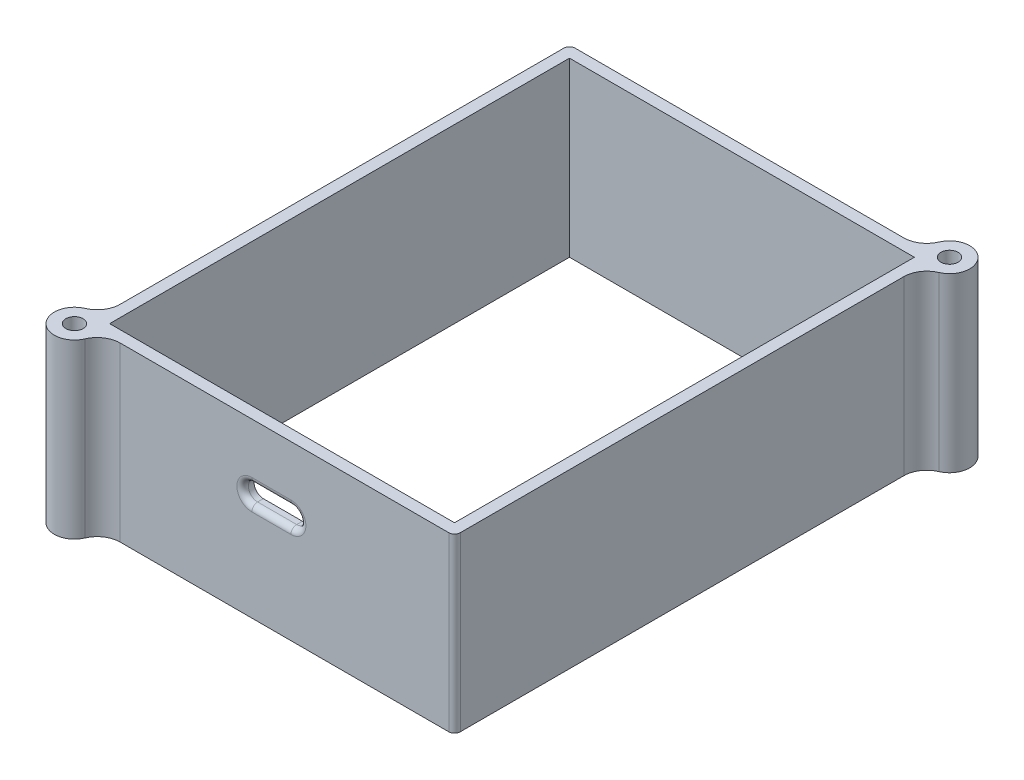
ISO-10303-21;
HEADER;
FILE_DESCRIPTION(('STEP AP214'),'2;1');
FILE_NAME('part.step','',(''),(''),'','','');
FILE_SCHEMA(('AUTOMOTIVE_DESIGN { 1 0 10303 214 1 1 1 1 }'));
ENDSEC;
DATA;
#1=APPLICATION_CONTEXT('core data for automotive mechanical design processes');
#2=APPLICATION_PROTOCOL_DEFINITION('international standard','automotive_design',2000,#1);
#3=PRODUCT_CONTEXT('',#1,'mechanical');
#4=PRODUCT('Part','Part','',(#3));
#5=PRODUCT_RELATED_PRODUCT_CATEGORY('part','',(#4));
#6=PRODUCT_DEFINITION_FORMATION('','',#4);
#7=PRODUCT_DEFINITION_CONTEXT('part definition',#1,'design');
#8=PRODUCT_DEFINITION('design','',#6,#7);
#9=PRODUCT_DEFINITION_SHAPE('','',#8);
#10=(LENGTH_UNIT() NAMED_UNIT(*) SI_UNIT(.MILLI.,.METRE.));
#11=(NAMED_UNIT(*) PLANE_ANGLE_UNIT() SI_UNIT($,.RADIAN.));
#12=(NAMED_UNIT(*) SI_UNIT($,.STERADIAN.) SOLID_ANGLE_UNIT());
#13=UNCERTAINTY_MEASURE_WITH_UNIT(LENGTH_MEASURE(1.E-05),#10,'distance_accuracy_value','');
#14=(GEOMETRIC_REPRESENTATION_CONTEXT(3) GLOBAL_UNCERTAINTY_ASSIGNED_CONTEXT((#13)) GLOBAL_UNIT_ASSIGNED_CONTEXT((#10,
#11,#12)) REPRESENTATION_CONTEXT('',''));
#15=CARTESIAN_POINT('',(0.,0.,0.));
#16=DIRECTION('',(0.,0.,1.));
#17=DIRECTION('',(1.,0.,0.));
#18=AXIS2_PLACEMENT_3D('',#15,#16,#17);
#19=CARTESIAN_POINT('',(62.,30.,82.));
#20=DIRECTION('',(0.,0.,-1.));
#21=DIRECTION('',(-1.,0.,0.));
#22=AXIS2_PLACEMENT_3D('',#19,#20,#21);
#23=PLANE('',#22);
#24=DIRECTION('',(1.,0.,0.));
#25=VECTOR('',#24,1.);
#26=CARTESIAN_POINT('',(62.,16.,82.));
#27=LINE('',#26,#25);
#28=CARTESIAN_POINT('',(33.5413148667545,16.,82.));
#29=VERTEX_POINT('',#28);
#30=CARTESIAN_POINT('',(26.7413148667545,16.,82.));
#31=VERTEX_POINT('',#30);
#32=EDGE_CURVE('E229',#29,#31,#27,.F.);
#33=ORIENTED_EDGE('',*,*,#32,.T.);
#34=CARTESIAN_POINT('',(26.7413148667545,18.6,82.));
#35=DIRECTION('',(0.,0.,-1.));
#36=DIRECTION('',(-1.,0.,0.));
#37=AXIS2_PLACEMENT_3D('',#34,#35,#36);
#38=CIRCLE('',#37,2.6);
#39=CARTESIAN_POINT('',(26.7413148667545,21.2,82.));
#40=VERTEX_POINT('',#39);
#41=EDGE_CURVE('E242',#31,#40,#38,.T.);
#42=ORIENTED_EDGE('',*,*,#41,.T.);
#43=DIRECTION('',(-1.,0.,0.));
#44=VECTOR('',#43,1.);
#45=CARTESIAN_POINT('',(62.,21.2,82.));
#46=LINE('',#45,#44);
#47=CARTESIAN_POINT('',(33.5413148667545,21.2,82.));
#48=VERTEX_POINT('',#47);
#49=EDGE_CURVE('E239',#40,#48,#46,.F.);
#50=ORIENTED_EDGE('',*,*,#49,.T.);
#51=CARTESIAN_POINT('',(33.5413148667545,18.6,82.));
#52=DIRECTION('',(0.,0.,-1.));
#53=DIRECTION('',(-1.,0.,0.));
#54=AXIS2_PLACEMENT_3D('',#51,#52,#53);
#55=CIRCLE('',#54,2.6);
#56=EDGE_CURVE('E236',#48,#29,#55,.T.);
#57=ORIENTED_EDGE('',*,*,#56,.T.);
#58=EDGE_LOOP('',(#33,#42,#50,#57));
#59=FACE_BOUND('',#58,.T.);
#60=DIRECTION('',(1.,0.,0.));
#61=VECTOR('',#60,1.);
#62=CARTESIAN_POINT('',(62.,0.,82.));
#63=LINE('',#62,#61);
#64=CARTESIAN_POINT('',(3.83936021762763,0.,82.));
#65=VERTEX_POINT('',#64);
#66=CARTESIAN_POINT('',(61.,0.,82.));
#67=VERTEX_POINT('',#66);
#68=EDGE_CURVE('E358',#65,#67,#63,.T.);
#69=ORIENTED_EDGE('',*,*,#68,.T.);
#70=DIRECTION('',(0.,-1.,0.));
#71=VECTOR('',#70,1.);
#72=CARTESIAN_POINT('',(61.,30.,82.));
#73=LINE('',#72,#71);
#74=CARTESIAN_POINT('',(61.,30.,82.));
#75=VERTEX_POINT('',#74);
#76=EDGE_CURVE('E11',#67,#75,#73,.F.);
#77=ORIENTED_EDGE('',*,*,#76,.T.);
#78=DIRECTION('',(1.,0.,0.));
#79=VECTOR('',#78,1.);
#80=CARTESIAN_POINT('',(62.,30.,82.));
#81=LINE('',#80,#79);
#82=CARTESIAN_POINT('',(3.83936021762763,30.,82.));
#83=VERTEX_POINT('',#82);
#84=EDGE_CURVE('E370',#83,#75,#81,.T.);
#85=ORIENTED_EDGE('',*,*,#84,.F.);
#86=DIRECTION('',(0.,1.,0.));
#87=VECTOR('',#86,1.);
#88=CARTESIAN_POINT('',(3.83936021762763,0.,82.));
#89=LINE('',#88,#87);
#90=EDGE_CURVE('E294',#83,#65,#89,.F.);
#91=ORIENTED_EDGE('',*,*,#90,.T.);
#92=EDGE_LOOP('',(#69,#77,#85,#91));
#93=FACE_BOUND('',#92,.T.);
#94=ADVANCED_FACE('F44',(#59,#93),#23,.F.);
#95=CARTESIAN_POINT('',(62.,30.,-2.));
#96=DIRECTION('',(-1.,0.,0.));
#97=DIRECTION('',(0.,0.,1.));
#98=AXIS2_PLACEMENT_3D('',#95,#96,#97);
#99=PLANE('',#98);
#100=DIRECTION('',(0.,0.,-1.));
#101=VECTOR('',#100,1.);
#102=CARTESIAN_POINT('',(62.,30.,-2.));
#103=LINE('',#102,#101);
#104=CARTESIAN_POINT('',(62.,30.,81.));
#105=VERTEX_POINT('',#104);
#106=CARTESIAN_POINT('',(62.,30.,3.83936021762763));
#107=VERTEX_POINT('',#106);
#108=EDGE_CURVE('E347',#105,#107,#103,.T.);
#109=ORIENTED_EDGE('',*,*,#108,.F.);
#110=DIRECTION('',(0.,-1.,0.));
#111=VECTOR('',#110,1.);
#112=CARTESIAN_POINT('',(62.,30.,81.));
#113=LINE('',#112,#111);
#114=CARTESIAN_POINT('',(62.,0.,81.));
#115=VERTEX_POINT('',#114);
#116=EDGE_CURVE('E53',#105,#115,#113,.T.);
#117=ORIENTED_EDGE('',*,*,#116,.T.);
#118=DIRECTION('',(0.,0.,-1.));
#119=VECTOR('',#118,1.);
#120=CARTESIAN_POINT('',(62.,0.,-2.));
#121=LINE('',#120,#119);
#122=CARTESIAN_POINT('',(62.,0.,3.83936021762763));
#123=VERTEX_POINT('',#122);
#124=EDGE_CURVE('E346',#115,#123,#121,.T.);
#125=ORIENTED_EDGE('',*,*,#124,.T.);
#126=DIRECTION('',(0.,1.,0.));
#127=VECTOR('',#126,1.);
#128=CARTESIAN_POINT('',(62.,30.,3.83936021762763));
#129=LINE('',#128,#127);
#130=EDGE_CURVE('E275',#123,#107,#129,.T.);
#131=ORIENTED_EDGE('',*,*,#130,.T.);
#132=EDGE_LOOP('',(#109,#117,#125,#131));
#133=FACE_BOUND('',#132,.T.);
#134=ADVANCED_FACE('F345',(#133),#99,.F.);
#135=CARTESIAN_POINT('',(-2.,30.,-2.));
#136=DIRECTION('',(0.,0.,1.));
#137=DIRECTION('',(1.,0.,0.));
#138=AXIS2_PLACEMENT_3D('',#135,#136,#137);
#139=PLANE('',#138);
#140=DIRECTION('',(-1.,0.,0.));
#141=VECTOR('',#140,1.);
#142=CARTESIAN_POINT('',(-2.,0.,-2.));
#143=LINE('',#142,#141);
#144=CARTESIAN_POINT('',(56.1606397823724,0.,-2.));
#145=VERTEX_POINT('',#144);
#146=CARTESIAN_POINT('',(-1.,0.,-2.));
#147=VERTEX_POINT('',#146);
#148=EDGE_CURVE('E357',#145,#147,#143,.T.);
#149=ORIENTED_EDGE('',*,*,#148,.T.);
#150=DIRECTION('',(0.,-1.,0.));
#151=VECTOR('',#150,1.);
#152=CARTESIAN_POINT('',(-1.,30.,-2.));
#153=LINE('',#152,#151);
#154=CARTESIAN_POINT('',(-1.,30.,-2.));
#155=VERTEX_POINT('',#154);
#156=EDGE_CURVE('E333',#147,#155,#153,.F.);
#157=ORIENTED_EDGE('',*,*,#156,.T.);
#158=DIRECTION('',(-1.,0.,0.));
#159=VECTOR('',#158,1.);
#160=CARTESIAN_POINT('',(-2.,30.,-2.));
#161=LINE('',#160,#159);
#162=CARTESIAN_POINT('',(56.1606397823724,30.,-2.));
#163=VERTEX_POINT('',#162);
#164=EDGE_CURVE('E467',#163,#155,#161,.T.);
#165=ORIENTED_EDGE('',*,*,#164,.F.);
#166=DIRECTION('',(0.,1.,0.));
#167=VECTOR('',#166,1.);
#168=CARTESIAN_POINT('',(56.1606397823724,0.,-2.));
#169=LINE('',#168,#167);
#170=EDGE_CURVE('E279',#163,#145,#169,.F.);
#171=ORIENTED_EDGE('',*,*,#170,.T.);
#172=EDGE_LOOP('',(#149,#157,#165,#171));
#173=FACE_BOUND('',#172,.T.);
#174=ADVANCED_FACE('F505',(#173),#139,.F.);
#175=CARTESIAN_POINT('',(-2.,30.,82.));
#176=DIRECTION('',(1.,0.,0.));
#177=DIRECTION('',(0.,0.,-1.));
#178=AXIS2_PLACEMENT_3D('',#175,#176,#177);
#179=PLANE('',#178);
#180=DIRECTION('',(0.,0.,1.));
#181=VECTOR('',#180,1.);
#182=CARTESIAN_POINT('',(-2.,30.,82.));
#183=LINE('',#182,#181);
#184=CARTESIAN_POINT('',(-2.,30.,-0.999999999999973));
#185=VERTEX_POINT('',#184);
#186=CARTESIAN_POINT('',(-2.,30.,76.1606397823724));
#187=VERTEX_POINT('',#186);
#188=EDGE_CURVE('E207',#185,#187,#183,.T.);
#189=ORIENTED_EDGE('',*,*,#188,.F.);
#190=DIRECTION('',(0.,-1.,0.));
#191=VECTOR('',#190,1.);
#192=CARTESIAN_POINT('',(-2.,30.,-1.));
#193=LINE('',#192,#191);
#194=CARTESIAN_POINT('',(-2.,0.,-0.999999999999973));
#195=VERTEX_POINT('',#194);
#196=EDGE_CURVE('E323',#185,#195,#193,.T.);
#197=ORIENTED_EDGE('',*,*,#196,.T.);
#198=DIRECTION('',(0.,0.,1.));
#199=VECTOR('',#198,1.);
#200=CARTESIAN_POINT('',(-2.,0.,82.));
#201=LINE('',#200,#199);
#202=CARTESIAN_POINT('',(-2.,0.,76.1606397823724));
#203=VERTEX_POINT('',#202);
#204=EDGE_CURVE('E363',#195,#203,#201,.T.);
#205=ORIENTED_EDGE('',*,*,#204,.T.);
#206=DIRECTION('',(0.,1.,0.));
#207=VECTOR('',#206,1.);
#208=CARTESIAN_POINT('',(-2.,30.,76.1606397823724));
#209=LINE('',#208,#207);
#210=EDGE_CURVE('E290',#203,#187,#209,.T.);
#211=ORIENTED_EDGE('',*,*,#210,.T.);
#212=EDGE_LOOP('',(#189,#197,#205,#211));
#213=FACE_BOUND('',#212,.T.);
#214=ADVANCED_FACE('F480',(#213),#179,.F.);
#215=CARTESIAN_POINT('',(0.,30.,0.));
#216=DIRECTION('',(0.,-1.,0.));
#217=DIRECTION('',(0.,0.,-1.));
#218=AXIS2_PLACEMENT_3D('',#215,#216,#217);
#219=PLANE('',#218);
#220=ORIENTED_EDGE('',*,*,#164,.T.);
#221=CARTESIAN_POINT('',(-1.,30.,-1.));
#222=DIRECTION('',(0.,-1.,0.));
#223=DIRECTION('',(0.,0.,-1.));
#224=AXIS2_PLACEMENT_3D('',#221,#222,#223);
#225=CIRCLE('',#224,1.);
#226=EDGE_CURVE('E338',#155,#185,#225,.F.);
#227=ORIENTED_EDGE('',*,*,#226,.T.);
#228=ORIENTED_EDGE('',*,*,#188,.T.);
#229=CARTESIAN_POINT('',(-6.,30.,76.1606397823724));
#230=DIRECTION('',(0.,-1.,0.));
#231=DIRECTION('',(0.,0.,-1.));
#232=AXIS2_PLACEMENT_3D('',#229,#230,#231);
#233=CIRCLE('',#232,4.);
#234=CARTESIAN_POINT('',(-4.4323520916159,30.,79.840650656723));
#235=VERTEX_POINT('',#234);
#236=EDGE_CURVE('E314',#187,#235,#233,.T.);
#237=ORIENTED_EDGE('',*,*,#236,.T.);
#238=CARTESIAN_POINT('',(-3.06066017177982,30.,83.0606601717798));
#239=DIRECTION('',(0.,1.,0.));
#240=DIRECTION('',(0.,0.,1.));
#241=AXIS2_PLACEMENT_3D('',#238,#239,#240);
#242=CIRCLE('',#241,3.5);
#243=CARTESIAN_POINT('',(0.159349343276988,30.,84.4323520916159));
#244=VERTEX_POINT('',#243);
#245=EDGE_CURVE('E400',#235,#244,#242,.T.);
#246=ORIENTED_EDGE('',*,*,#245,.T.);
#247=CARTESIAN_POINT('',(3.83936021762763,30.,86.));
#248=DIRECTION('',(0.,-1.,0.));
#249=DIRECTION('',(0.,0.,-1.));
#250=AXIS2_PLACEMENT_3D('',#247,#248,#249);
#251=CIRCLE('',#250,4.);
#252=EDGE_CURVE('E317',#244,#83,#251,.T.);
#253=ORIENTED_EDGE('',*,*,#252,.T.);
#254=ORIENTED_EDGE('',*,*,#84,.T.);
#255=CARTESIAN_POINT('',(61.,30.,81.));
#256=DIRECTION('',(0.,-1.,0.));
#257=DIRECTION('',(0.,0.,-1.));
#258=AXIS2_PLACEMENT_3D('',#255,#256,#257);
#259=CIRCLE('',#258,1.);
#260=EDGE_CURVE('E60',#75,#105,#259,.F.);
#261=ORIENTED_EDGE('',*,*,#260,.T.);
#262=ORIENTED_EDGE('',*,*,#108,.T.);
#263=CARTESIAN_POINT('',(66.,30.,3.83936021762763));
#264=DIRECTION('',(0.,-1.,0.));
#265=DIRECTION('',(0.,0.,-1.));
#266=AXIS2_PLACEMENT_3D('',#263,#264,#265);
#267=CIRCLE('',#266,4.);
#268=CARTESIAN_POINT('',(64.4323520916159,30.,0.159349343276991));
#269=VERTEX_POINT('',#268);
#270=EDGE_CURVE('E301',#107,#269,#267,.T.);
#271=ORIENTED_EDGE('',*,*,#270,.T.);
#272=CARTESIAN_POINT('',(63.0606601717798,30.,-3.06066017177982));
#273=DIRECTION('',(0.,1.,0.));
#274=DIRECTION('',(0.,0.,1.));
#275=AXIS2_PLACEMENT_3D('',#272,#273,#274);
#276=CIRCLE('',#275,3.50000000000001);
#277=CARTESIAN_POINT('',(59.840650656723,30.,-4.43235209161591));
#278=VERTEX_POINT('',#277);
#279=EDGE_CURVE('E386',#269,#278,#276,.T.);
#280=ORIENTED_EDGE('',*,*,#279,.T.);
#281=CARTESIAN_POINT('',(56.1606397823724,30.,-6.));
#282=DIRECTION('',(0.,-1.,0.));
#283=DIRECTION('',(0.,0.,-1.));
#284=AXIS2_PLACEMENT_3D('',#281,#282,#283);
#285=CIRCLE('',#284,4.);
#286=EDGE_CURVE('E304',#278,#163,#285,.T.);
#287=ORIENTED_EDGE('',*,*,#286,.T.);
#288=EDGE_LOOP('',(#220,#227,#228,#237,#246,#253,#254,#261,#262,#271,#280,#287));
#289=FACE_BOUND('',#288,.T.);
#290=DIRECTION('',(0.,0.,1.));
#291=VECTOR('',#290,1.);
#292=CARTESIAN_POINT('',(0.,30.,80.));
#293=LINE('',#292,#291);
#294=CARTESIAN_POINT('',(0.,30.,0.));
#295=VERTEX_POINT('',#294);
#296=CARTESIAN_POINT('',(0.,30.,80.));
#297=VERTEX_POINT('',#296);
#298=EDGE_CURVE('E422',#295,#297,#293,.T.);
#299=ORIENTED_EDGE('',*,*,#298,.F.);
#300=DIRECTION('',(-1.,0.,0.));
#301=VECTOR('',#300,1.);
#302=CARTESIAN_POINT('',(0.,30.,0.));
#303=LINE('',#302,#301);
#304=CARTESIAN_POINT('',(60.,30.,0.));
#305=VERTEX_POINT('',#304);
#306=EDGE_CURVE('E433',#305,#295,#303,.T.);
#307=ORIENTED_EDGE('',*,*,#306,.F.);
#308=DIRECTION('',(0.,0.,-1.));
#309=VECTOR('',#308,1.);
#310=CARTESIAN_POINT('',(60.,30.,0.));
#311=LINE('',#310,#309);
#312=CARTESIAN_POINT('',(60.,30.,80.));
#313=VERTEX_POINT('',#312);
#314=EDGE_CURVE('E429',#313,#305,#311,.T.);
#315=ORIENTED_EDGE('',*,*,#314,.F.);
#316=DIRECTION('',(1.,0.,0.));
#317=VECTOR('',#316,1.);
#318=CARTESIAN_POINT('',(60.,30.,80.));
#319=LINE('',#318,#317);
#320=EDGE_CURVE('E425',#297,#313,#319,.T.);
#321=ORIENTED_EDGE('',*,*,#320,.F.);
#322=EDGE_LOOP('',(#299,#307,#315,#321));
#323=FACE_BOUND('',#322,.T.);
#324=CARTESIAN_POINT('',(63.0606601717798,30.,-3.06066017177982));
#325=DIRECTION('',(0.,1.,0.));
#326=DIRECTION('',(0.,0.,1.));
#327=AXIS2_PLACEMENT_3D('',#324,#325,#326);
#328=CIRCLE('',#327,1.5);
#329=CARTESIAN_POINT('',(63.0606601717798,30.,-1.56066017177983));
#330=VERTEX_POINT('',#329);
#331=EDGE_CURVE('E412',#330,#330,#328,.T.);
#332=ORIENTED_EDGE('',*,*,#331,.F.);
#333=EDGE_LOOP('',(#332));
#334=FACE_BOUND('',#333,.T.);
#335=CARTESIAN_POINT('',(-3.06066017177982,30.,83.0606601717798));
#336=DIRECTION('',(0.,1.,0.));
#337=DIRECTION('',(0.,0.,1.));
#338=AXIS2_PLACEMENT_3D('',#335,#336,#337);
#339=CIRCLE('',#338,1.5);
#340=CARTESIAN_POINT('',(-3.06066017177982,30.,84.5606601717798));
#341=VERTEX_POINT('',#340);
#342=EDGE_CURVE('E390',#341,#341,#339,.T.);
#343=ORIENTED_EDGE('',*,*,#342,.F.);
#344=EDGE_LOOP('',(#343));
#345=FACE_BOUND('',#344,.T.);
#346=ADVANCED_FACE('F472',(#289,#323,#334,#345),#219,.F.);
#347=CARTESIAN_POINT('',(0.,0.,0.));
#348=DIRECTION('',(0.,-1.,0.));
#349=DIRECTION('',(0.,0.,-1.));
#350=AXIS2_PLACEMENT_3D('',#347,#348,#349);
#351=PLANE('',#350);
#352=ORIENTED_EDGE('',*,*,#204,.F.);
#353=CARTESIAN_POINT('',(-1.,0.,-1.));
#354=DIRECTION('',(0.,-1.,0.));
#355=DIRECTION('',(0.,0.,-1.));
#356=AXIS2_PLACEMENT_3D('',#353,#354,#355);
#357=CIRCLE('',#356,1.);
#358=EDGE_CURVE('E330',#195,#147,#357,.T.);
#359=ORIENTED_EDGE('',*,*,#358,.T.);
#360=ORIENTED_EDGE('',*,*,#148,.F.);
#361=CARTESIAN_POINT('',(56.1606397823724,0.,-6.));
#362=DIRECTION('',(0.,-1.,0.));
#363=DIRECTION('',(0.,0.,-1.));
#364=AXIS2_PLACEMENT_3D('',#361,#362,#363);
#365=CIRCLE('',#364,4.);
#366=CARTESIAN_POINT('',(59.840650656723,0.,-4.43235209161591));
#367=VERTEX_POINT('',#366);
#368=EDGE_CURVE('E307',#145,#367,#365,.F.);
#369=ORIENTED_EDGE('',*,*,#368,.T.);
#370=CARTESIAN_POINT('',(63.0606601717798,0.,-3.06066017177982));
#371=DIRECTION('',(0.,1.,0.));
#372=DIRECTION('',(0.,0.,1.));
#373=AXIS2_PLACEMENT_3D('',#370,#371,#372);
#374=CIRCLE('',#373,3.50000000000001);
#375=CARTESIAN_POINT('',(64.4323520916159,0.,0.159349343276991));
#376=VERTEX_POINT('',#375);
#377=EDGE_CURVE('E408',#376,#367,#374,.T.);
#378=ORIENTED_EDGE('',*,*,#377,.F.);
#379=CARTESIAN_POINT('',(66.,0.,3.83936021762763));
#380=DIRECTION('',(0.,-1.,0.));
#381=DIRECTION('',(0.,0.,-1.));
#382=AXIS2_PLACEMENT_3D('',#379,#380,#381);
#383=CIRCLE('',#382,4.);
#384=EDGE_CURVE('E297',#376,#123,#383,.F.);
#385=ORIENTED_EDGE('',*,*,#384,.T.);
#386=ORIENTED_EDGE('',*,*,#124,.F.);
#387=CARTESIAN_POINT('',(61.,0.,81.));
#388=DIRECTION('',(0.,-1.,0.));
#389=DIRECTION('',(0.,0.,-1.));
#390=AXIS2_PLACEMENT_3D('',#387,#388,#389);
#391=CIRCLE('',#390,1.);
#392=EDGE_CURVE('E327',#115,#67,#391,.T.);
#393=ORIENTED_EDGE('',*,*,#392,.T.);
#394=ORIENTED_EDGE('',*,*,#68,.F.);
#395=CARTESIAN_POINT('',(3.83936021762763,0.,86.));
#396=DIRECTION('',(0.,-1.,0.));
#397=DIRECTION('',(0.,0.,-1.));
#398=AXIS2_PLACEMENT_3D('',#395,#396,#397);
#399=CIRCLE('',#398,4.);
#400=CARTESIAN_POINT('',(0.159349343276988,0.,84.4323520916159));
#401=VERTEX_POINT('',#400);
#402=EDGE_CURVE('E320',#65,#401,#399,.F.);
#403=ORIENTED_EDGE('',*,*,#402,.T.);
#404=CARTESIAN_POINT('',(-3.06066017177982,0.,83.0606601717798));
#405=DIRECTION('',(0.,1.,0.));
#406=DIRECTION('',(0.,0.,1.));
#407=AXIS2_PLACEMENT_3D('',#404,#405,#406);
#408=CIRCLE('',#407,3.5);
#409=CARTESIAN_POINT('',(-4.4323520916159,0.,79.840650656723));
#410=VERTEX_POINT('',#409);
#411=EDGE_CURVE('E394',#410,#401,#408,.T.);
#412=ORIENTED_EDGE('',*,*,#411,.F.);
#413=CARTESIAN_POINT('',(-6.,0.,76.1606397823724));
#414=DIRECTION('',(0.,-1.,0.));
#415=DIRECTION('',(0.,0.,-1.));
#416=AXIS2_PLACEMENT_3D('',#413,#414,#415);
#417=CIRCLE('',#416,4.);
#418=EDGE_CURVE('E310',#410,#203,#417,.F.);
#419=ORIENTED_EDGE('',*,*,#418,.T.);
#420=EDGE_LOOP('',(#352,#359,#360,#369,#378,#385,#386,#393,#394,#403,#412,#419));
#421=FACE_BOUND('',#420,.T.);
#422=DIRECTION('',(-1.,0.,0.));
#423=VECTOR('',#422,1.);
#424=CARTESIAN_POINT('',(0.,0.,0.));
#425=LINE('',#424,#423);
#426=CARTESIAN_POINT('',(60.,0.,0.));
#427=VERTEX_POINT('',#426);
#428=CARTESIAN_POINT('',(0.,0.,0.));
#429=VERTEX_POINT('',#428);
#430=EDGE_CURVE('E426',#427,#429,#425,.T.);
#431=ORIENTED_EDGE('',*,*,#430,.T.);
#432=DIRECTION('',(0.,0.,1.));
#433=VECTOR('',#432,1.);
#434=CARTESIAN_POINT('',(0.,0.,80.));
#435=LINE('',#434,#433);
#436=CARTESIAN_POINT('',(0.,0.,80.));
#437=VERTEX_POINT('',#436);
#438=EDGE_CURVE('E404',#429,#437,#435,.T.);
#439=ORIENTED_EDGE('',*,*,#438,.T.);
#440=DIRECTION('',(1.,0.,0.));
#441=VECTOR('',#440,1.);
#442=CARTESIAN_POINT('',(60.,0.,80.));
#443=LINE('',#442,#441);
#444=CARTESIAN_POINT('',(60.,0.,80.));
#445=VERTEX_POINT('',#444);
#446=EDGE_CURVE('E440',#437,#445,#443,.T.);
#447=ORIENTED_EDGE('',*,*,#446,.T.);
#448=DIRECTION('',(0.,0.,-1.));
#449=VECTOR('',#448,1.);
#450=CARTESIAN_POINT('',(60.,0.,0.));
#451=LINE('',#450,#449);
#452=EDGE_CURVE('E444',#445,#427,#451,.T.);
#453=ORIENTED_EDGE('',*,*,#452,.T.);
#454=EDGE_LOOP('',(#431,#439,#447,#453));
#455=FACE_BOUND('',#454,.T.);
#456=CARTESIAN_POINT('',(63.0606601717798,0.,-3.06066017177982));
#457=DIRECTION('',(0.,1.,0.));
#458=DIRECTION('',(0.,0.,1.));
#459=AXIS2_PLACEMENT_3D('',#456,#457,#458);
#460=CIRCLE('',#459,1.5);
#461=CARTESIAN_POINT('',(63.0606601717798,0.,-1.56066017177983));
#462=VERTEX_POINT('',#461);
#463=EDGE_CURVE('E399',#462,#462,#460,.T.);
#464=ORIENTED_EDGE('',*,*,#463,.T.);
#465=EDGE_LOOP('',(#464));
#466=FACE_BOUND('',#465,.T.);
#467=CARTESIAN_POINT('',(-3.06066017177982,0.,83.0606601717798));
#468=DIRECTION('',(0.,1.,0.));
#469=DIRECTION('',(0.,0.,1.));
#470=AXIS2_PLACEMENT_3D('',#467,#468,#469);
#471=CIRCLE('',#470,1.5);
#472=CARTESIAN_POINT('',(-3.06066017177982,0.,84.5606601717798));
#473=VERTEX_POINT('',#472);
#474=EDGE_CURVE('E395',#473,#473,#471,.T.);
#475=ORIENTED_EDGE('',*,*,#474,.T.);
#476=EDGE_LOOP('',(#475));
#477=FACE_BOUND('',#476,.T.);
#478=ADVANCED_FACE('F351',(#421,#455,#466,#477),#351,.T.);
#479=CARTESIAN_POINT('',(0.,30.,80.));
#480=DIRECTION('',(1.,0.,0.));
#481=DIRECTION('',(0.,0.,-1.));
#482=AXIS2_PLACEMENT_3D('',#479,#480,#481);
#483=PLANE('',#482);
#484=ORIENTED_EDGE('',*,*,#438,.F.);
#485=DIRECTION('',(0.,-1.,0.));
#486=VECTOR('',#485,1.);
#487=CARTESIAN_POINT('',(0.,30.,0.));
#488=LINE('',#487,#486);
#489=EDGE_CURVE('E436',#295,#429,#488,.T.);
#490=ORIENTED_EDGE('',*,*,#489,.F.);
#491=ORIENTED_EDGE('',*,*,#298,.T.);
#492=DIRECTION('',(0.,-1.,0.));
#493=VECTOR('',#492,1.);
#494=CARTESIAN_POINT('',(0.,30.,80.));
#495=LINE('',#494,#493);
#496=EDGE_CURVE('E365',#297,#437,#495,.T.);
#497=ORIENTED_EDGE('',*,*,#496,.T.);
#498=EDGE_LOOP('',(#484,#490,#491,#497));
#499=FACE_BOUND('',#498,.T.);
#500=ADVANCED_FACE('F632',(#499),#483,.T.);
#501=CARTESIAN_POINT('',(60.,30.,80.));
#502=DIRECTION('',(0.,0.,-1.));
#503=DIRECTION('',(-1.,0.,0.));
#504=AXIS2_PLACEMENT_3D('',#501,#502,#503);
#505=PLANE('',#504);
#506=DIRECTION('',(-1.,0.,0.));
#507=VECTOR('',#506,1.);
#508=CARTESIAN_POINT('',(60.,17.,80.));
#509=LINE('',#508,#507);
#510=CARTESIAN_POINT('',(33.5413148667545,17.,80.));
#511=VERTEX_POINT('',#510);
#512=CARTESIAN_POINT('',(26.7413148667545,17.,80.));
#513=VERTEX_POINT('',#512);
#514=EDGE_CURVE('E212',#511,#513,#509,.T.);
#515=ORIENTED_EDGE('',*,*,#514,.F.);
#516=CARTESIAN_POINT('',(33.5413148667545,18.6,80.));
#517=DIRECTION('',(0.,0.,-1.));
#518=DIRECTION('',(-1.,0.,0.));
#519=AXIS2_PLACEMENT_3D('',#516,#517,#518);
#520=CIRCLE('',#519,1.6);
#521=CARTESIAN_POINT('',(33.5413148667545,20.2,80.));
#522=VERTEX_POINT('',#521);
#523=EDGE_CURVE('E194',#522,#511,#520,.T.);
#524=ORIENTED_EDGE('',*,*,#523,.F.);
#525=DIRECTION('',(1.,0.,0.));
#526=VECTOR('',#525,1.);
#527=CARTESIAN_POINT('',(60.,20.2,80.));
#528=LINE('',#527,#526);
#529=CARTESIAN_POINT('',(26.7413148667545,20.2,80.));
#530=VERTEX_POINT('',#529);
#531=EDGE_CURVE('E206',#530,#522,#528,.T.);
#532=ORIENTED_EDGE('',*,*,#531,.F.);
#533=CARTESIAN_POINT('',(26.7413148667545,18.6,80.));
#534=DIRECTION('',(0.,0.,-1.));
#535=DIRECTION('',(-1.,0.,0.));
#536=AXIS2_PLACEMENT_3D('',#533,#534,#535);
#537=CIRCLE('',#536,1.6);
#538=EDGE_CURVE('E222',#513,#530,#537,.T.);
#539=ORIENTED_EDGE('',*,*,#538,.F.);
#540=EDGE_LOOP('',(#515,#524,#532,#539));
#541=FACE_BOUND('',#540,.T.);
#542=ORIENTED_EDGE('',*,*,#446,.F.);
#543=ORIENTED_EDGE('',*,*,#496,.F.);
#544=ORIENTED_EDGE('',*,*,#320,.T.);
#545=DIRECTION('',(0.,-1.,0.));
#546=VECTOR('',#545,1.);
#547=CARTESIAN_POINT('',(60.,30.,80.));
#548=LINE('',#547,#546);
#549=EDGE_CURVE('E457',#313,#445,#548,.T.);
#550=ORIENTED_EDGE('',*,*,#549,.T.);
#551=EDGE_LOOP('',(#542,#543,#544,#550));
#552=FACE_BOUND('',#551,.T.);
#553=ADVANCED_FACE('F220',(#541,#552),#505,.T.);
#554=CARTESIAN_POINT('',(60.,30.,0.));
#555=DIRECTION('',(-1.,0.,0.));
#556=DIRECTION('',(0.,0.,1.));
#557=AXIS2_PLACEMENT_3D('',#554,#555,#556);
#558=PLANE('',#557);
#559=ORIENTED_EDGE('',*,*,#452,.F.);
#560=ORIENTED_EDGE('',*,*,#549,.F.);
#561=ORIENTED_EDGE('',*,*,#314,.T.);
#562=DIRECTION('',(0.,-1.,0.));
#563=VECTOR('',#562,1.);
#564=CARTESIAN_POINT('',(60.,30.,0.));
#565=LINE('',#564,#563);
#566=EDGE_CURVE('E454',#305,#427,#565,.T.);
#567=ORIENTED_EDGE('',*,*,#566,.T.);
#568=EDGE_LOOP('',(#559,#560,#561,#567));
#569=FACE_BOUND('',#568,.T.);
#570=ADVANCED_FACE('F631',(#569),#558,.T.);
#571=CARTESIAN_POINT('',(0.,30.,0.));
#572=DIRECTION('',(0.,0.,1.));
#573=DIRECTION('',(1.,0.,0.));
#574=AXIS2_PLACEMENT_3D('',#571,#572,#573);
#575=PLANE('',#574);
#576=ORIENTED_EDGE('',*,*,#430,.F.);
#577=ORIENTED_EDGE('',*,*,#566,.F.);
#578=ORIENTED_EDGE('',*,*,#306,.T.);
#579=ORIENTED_EDGE('',*,*,#489,.T.);
#580=EDGE_LOOP('',(#576,#577,#578,#579));
#581=FACE_BOUND('',#580,.T.);
#582=ADVANCED_FACE('F573',(#581),#575,.T.);
#583=CARTESIAN_POINT('',(-3.06066017177982,30.,83.0606601717798));
#584=DIRECTION('',(0.,-1.,0.));
#585=DIRECTION('',(0.,0.,-1.));
#586=AXIS2_PLACEMENT_3D('',#583,#584,#585);
#587=CYLINDRICAL_SURFACE('',#586,3.5);
#588=ORIENTED_EDGE('',*,*,#245,.F.);
#589=DIRECTION('',(0.,-1.,0.));
#590=VECTOR('',#589,1.);
#591=CARTESIAN_POINT('',(-4.4323520916159,30.,79.840650656723));
#592=LINE('',#591,#590);
#593=EDGE_CURVE('E286',#235,#410,#592,.T.);
#594=ORIENTED_EDGE('',*,*,#593,.T.);
#595=ORIENTED_EDGE('',*,*,#411,.T.);
#596=DIRECTION('',(0.,-1.,0.));
#597=VECTOR('',#596,1.);
#598=CARTESIAN_POINT('',(0.159349343276988,30.,84.4323520916159));
#599=LINE('',#598,#597);
#600=EDGE_CURVE('E282',#401,#244,#599,.F.);
#601=ORIENTED_EDGE('',*,*,#600,.T.);
#602=EDGE_LOOP('',(#588,#594,#595,#601));
#603=FACE_BOUND('',#602,.T.);
#604=ADVANCED_FACE('F486',(#603),#587,.T.);
#605=CARTESIAN_POINT('',(-3.06066017177982,30.,83.0606601717798));
#606=DIRECTION('',(0.,-1.,0.));
#607=DIRECTION('',(0.,0.,-1.));
#608=AXIS2_PLACEMENT_3D('',#605,#606,#607);
#609=CYLINDRICAL_SURFACE('',#608,1.5);
#610=ORIENTED_EDGE('',*,*,#474,.F.);
#611=EDGE_LOOP('',(#610));
#612=FACE_BOUND('',#611,.T.);
#613=ORIENTED_EDGE('',*,*,#342,.T.);
#614=EDGE_LOOP('',(#613));
#615=FACE_BOUND('',#614,.T.);
#616=ADVANCED_FACE('F563',(#612,#615),#609,.F.);
#617=CARTESIAN_POINT('',(63.0606601717798,30.,-3.06066017177982));
#618=DIRECTION('',(0.,-1.,0.));
#619=DIRECTION('',(0.,0.,-1.));
#620=AXIS2_PLACEMENT_3D('',#617,#618,#619);
#621=CYLINDRICAL_SURFACE('',#620,3.50000000000001);
#622=ORIENTED_EDGE('',*,*,#279,.F.);
#623=DIRECTION('',(0.,-1.,0.));
#624=VECTOR('',#623,1.);
#625=CARTESIAN_POINT('',(64.4323520916159,30.,0.159349343276991));
#626=LINE('',#625,#624);
#627=EDGE_CURVE('E271',#269,#376,#626,.T.);
#628=ORIENTED_EDGE('',*,*,#627,.T.);
#629=ORIENTED_EDGE('',*,*,#377,.T.);
#630=DIRECTION('',(0.,-1.,0.));
#631=VECTOR('',#630,1.);
#632=CARTESIAN_POINT('',(59.840650656723,30.,-4.43235209161591));
#633=LINE('',#632,#631);
#634=EDGE_CURVE('E254',#367,#278,#633,.F.);
#635=ORIENTED_EDGE('',*,*,#634,.T.);
#636=EDGE_LOOP('',(#622,#628,#629,#635));
#637=FACE_BOUND('',#636,.T.);
#638=ADVANCED_FACE('F558',(#637),#621,.T.);
#639=CARTESIAN_POINT('',(63.0606601717798,30.,-3.06066017177982));
#640=DIRECTION('',(0.,-1.,0.));
#641=DIRECTION('',(0.,0.,-1.));
#642=AXIS2_PLACEMENT_3D('',#639,#640,#641);
#643=CYLINDRICAL_SURFACE('',#642,1.5);
#644=ORIENTED_EDGE('',*,*,#331,.T.);
#645=EDGE_LOOP('',(#644));
#646=FACE_BOUND('',#645,.T.);
#647=ORIENTED_EDGE('',*,*,#463,.F.);
#648=EDGE_LOOP('',(#647));
#649=FACE_BOUND('',#648,.T.);
#650=ADVANCED_FACE('F562',(#646,#649),#643,.F.);
#651=CARTESIAN_POINT('',(30.1413148667545,17.,52.));
#652=DIRECTION('',(0.,-1.,0.));
#653=DIRECTION('',(0.,0.,-1.));
#654=AXIS2_PLACEMENT_3D('',#651,#652,#653);
#655=PLANE('',#654);
#656=DIRECTION('',(0.,0.,1.));
#657=VECTOR('',#656,1.);
#658=CARTESIAN_POINT('',(26.7413148667545,17.,52.));
#659=LINE('',#658,#657);
#660=CARTESIAN_POINT('',(26.7413148667545,17.,81.));
#661=VERTEX_POINT('',#660);
#662=EDGE_CURVE('E382',#513,#661,#659,.T.);
#663=ORIENTED_EDGE('',*,*,#662,.T.);
#664=DIRECTION('',(1.,0.,0.));
#665=VECTOR('',#664,1.);
#666=CARTESIAN_POINT('',(30.1413148667545,17.,81.));
#667=LINE('',#666,#665);
#668=CARTESIAN_POINT('',(33.5413148667545,17.,81.));
#669=VERTEX_POINT('',#668);
#670=EDGE_CURVE('E215',#661,#669,#667,.T.);
#671=ORIENTED_EDGE('',*,*,#670,.T.);
#672=DIRECTION('',(0.,0.,1.));
#673=VECTOR('',#672,1.);
#674=CARTESIAN_POINT('',(33.5413148667545,17.,52.));
#675=LINE('',#674,#673);
#676=EDGE_CURVE('E197',#511,#669,#675,.T.);
#677=ORIENTED_EDGE('',*,*,#676,.F.);
#678=ORIENTED_EDGE('',*,*,#514,.T.);
#679=EDGE_LOOP('',(#663,#671,#677,#678));
#680=FACE_BOUND('',#679,.T.);
#681=ADVANCED_FACE('F211',(#680),#655,.F.);
#682=CARTESIAN_POINT('',(26.7413148667545,18.6,52.));
#683=DIRECTION('',(0.,0.,1.));
#684=DIRECTION('',(1.,0.,0.));
#685=AXIS2_PLACEMENT_3D('',#682,#683,#684);
#686=CYLINDRICAL_SURFACE('',#685,1.6);
#687=DIRECTION('',(0.,0.,1.));
#688=VECTOR('',#687,1.);
#689=CARTESIAN_POINT('',(26.7413148667545,20.2,52.));
#690=LINE('',#689,#688);
#691=CARTESIAN_POINT('',(26.7413148667545,20.2,81.));
#692=VERTEX_POINT('',#691);
#693=EDGE_CURVE('E377',#530,#692,#690,.T.);
#694=ORIENTED_EDGE('',*,*,#693,.T.);
#695=CARTESIAN_POINT('',(26.7413148667545,18.6,81.));
#696=DIRECTION('',(0.,0.,-1.));
#697=DIRECTION('',(-1.,0.,0.));
#698=AXIS2_PLACEMENT_3D('',#695,#696,#697);
#699=CIRCLE('',#698,1.6);
#700=EDGE_CURVE('E224',#692,#661,#699,.F.);
#701=ORIENTED_EDGE('',*,*,#700,.T.);
#702=ORIENTED_EDGE('',*,*,#662,.F.);
#703=ORIENTED_EDGE('',*,*,#538,.T.);
#704=EDGE_LOOP('',(#694,#701,#702,#703));
#705=FACE_BOUND('',#704,.T.);
#706=ADVANCED_FACE('F609',(#705),#686,.F.);
#707=CARTESIAN_POINT('',(30.1413148667545,20.2,52.));
#708=DIRECTION('',(0.,1.,0.));
#709=DIRECTION('',(0.,0.,1.));
#710=AXIS2_PLACEMENT_3D('',#707,#708,#709);
#711=PLANE('',#710);
#712=DIRECTION('',(0.,0.,1.));
#713=VECTOR('',#712,1.);
#714=CARTESIAN_POINT('',(33.5413148667545,20.2,52.));
#715=LINE('',#714,#713);
#716=CARTESIAN_POINT('',(33.5413148667545,20.2,81.));
#717=VERTEX_POINT('',#716);
#718=EDGE_CURVE('E200',#522,#717,#715,.T.);
#719=ORIENTED_EDGE('',*,*,#718,.T.);
#720=DIRECTION('',(-1.,0.,0.));
#721=VECTOR('',#720,1.);
#722=CARTESIAN_POINT('',(30.1413148667545,20.2,81.));
#723=LINE('',#722,#721);
#724=EDGE_CURVE('E246',#717,#692,#723,.T.);
#725=ORIENTED_EDGE('',*,*,#724,.T.);
#726=ORIENTED_EDGE('',*,*,#693,.F.);
#727=ORIENTED_EDGE('',*,*,#531,.T.);
#728=EDGE_LOOP('',(#719,#725,#726,#727));
#729=FACE_BOUND('',#728,.T.);
#730=ADVANCED_FACE('F374',(#729),#711,.F.);
#731=CARTESIAN_POINT('',(33.5413148667545,18.6,52.));
#732=DIRECTION('',(0.,0.,1.));
#733=DIRECTION('',(1.,0.,0.));
#734=AXIS2_PLACEMENT_3D('',#731,#732,#733);
#735=CYLINDRICAL_SURFACE('',#734,1.6);
#736=ORIENTED_EDGE('',*,*,#676,.T.);
#737=CARTESIAN_POINT('',(33.5413148667545,18.6,81.));
#738=DIRECTION('',(0.,0.,-1.));
#739=DIRECTION('',(-1.,0.,0.));
#740=AXIS2_PLACEMENT_3D('',#737,#738,#739);
#741=CIRCLE('',#740,1.6);
#742=EDGE_CURVE('E249',#669,#717,#741,.F.);
#743=ORIENTED_EDGE('',*,*,#742,.T.);
#744=ORIENTED_EDGE('',*,*,#718,.F.);
#745=ORIENTED_EDGE('',*,*,#523,.T.);
#746=EDGE_LOOP('',(#736,#743,#744,#745));
#747=FACE_BOUND('',#746,.T.);
#748=ADVANCED_FACE('F196',(#747),#735,.F.);
#749=CARTESIAN_POINT('',(33.5413148667545,18.6,81.));
#750=DIRECTION('',(0.,0.,-1.));
#751=DIRECTION('',(-1.,0.,0.));
#752=AXIS2_PLACEMENT_3D('',#749,#750,#751);
#753=TOROIDAL_SURFACE('',#752,2.6,1.);
#754=CARTESIAN_POINT('',(33.5413148667545,16.,81.));
#755=DIRECTION('',(-1.,0.,0.));
#756=DIRECTION('',(0.,0.,1.));
#757=AXIS2_PLACEMENT_3D('',#754,#755,#756);
#758=CIRCLE('',#757,1.);
#759=EDGE_CURVE('E261',#29,#669,#758,.T.);
#760=ORIENTED_EDGE('',*,*,#759,.F.);
#761=ORIENTED_EDGE('',*,*,#56,.F.);
#762=CARTESIAN_POINT('',(33.5413148667545,21.2,81.));
#763=DIRECTION('',(-1.,0.,0.));
#764=DIRECTION('',(0.,0.,1.));
#765=AXIS2_PLACEMENT_3D('',#762,#763,#764);
#766=CIRCLE('',#765,1.);
#767=EDGE_CURVE('E217',#717,#48,#766,.T.);
#768=ORIENTED_EDGE('',*,*,#767,.F.);
#769=ORIENTED_EDGE('',*,*,#742,.F.);
#770=EDGE_LOOP('',(#760,#761,#768,#769));
#771=FACE_BOUND('',#770,.T.);
#772=ADVANCED_FACE('F521',(#771),#753,.T.);
#773=CARTESIAN_POINT('',(30.1413148667545,21.2,81.));
#774=DIRECTION('',(-1.,0.,0.));
#775=DIRECTION('',(0.,0.,1.));
#776=AXIS2_PLACEMENT_3D('',#773,#774,#775);
#777=CYLINDRICAL_SURFACE('',#776,1.);
#778=ORIENTED_EDGE('',*,*,#767,.T.);
#779=ORIENTED_EDGE('',*,*,#49,.F.);
#780=CARTESIAN_POINT('',(26.7413148667545,21.2,81.));
#781=DIRECTION('',(-1.,0.,0.));
#782=DIRECTION('',(0.,0.,1.));
#783=AXIS2_PLACEMENT_3D('',#780,#781,#782);
#784=CIRCLE('',#783,1.);
#785=EDGE_CURVE('E258',#692,#40,#784,.T.);
#786=ORIENTED_EDGE('',*,*,#785,.F.);
#787=ORIENTED_EDGE('',*,*,#724,.F.);
#788=EDGE_LOOP('',(#778,#779,#786,#787));
#789=FACE_BOUND('',#788,.T.);
#790=ADVANCED_FACE('F517',(#789),#777,.T.);
#791=CARTESIAN_POINT('',(30.1413148667545,16.,81.));
#792=DIRECTION('',(1.,0.,0.));
#793=DIRECTION('',(0.,0.,-1.));
#794=AXIS2_PLACEMENT_3D('',#791,#792,#793);
#795=CYLINDRICAL_SURFACE('',#794,1.);
#796=ORIENTED_EDGE('',*,*,#759,.T.);
#797=ORIENTED_EDGE('',*,*,#670,.F.);
#798=CARTESIAN_POINT('',(26.7413148667545,16.,81.));
#799=DIRECTION('',(-1.,0.,0.));
#800=DIRECTION('',(0.,0.,1.));
#801=AXIS2_PLACEMENT_3D('',#798,#799,#800);
#802=CIRCLE('',#801,1.);
#803=EDGE_CURVE('E255',#31,#661,#802,.T.);
#804=ORIENTED_EDGE('',*,*,#803,.F.);
#805=ORIENTED_EDGE('',*,*,#32,.F.);
#806=EDGE_LOOP('',(#796,#797,#804,#805));
#807=FACE_BOUND('',#806,.T.);
#808=ADVANCED_FACE('F513',(#807),#795,.T.);
#809=CARTESIAN_POINT('',(26.7413148667545,18.6,81.));
#810=DIRECTION('',(0.,0.,-1.));
#811=DIRECTION('',(-1.,0.,0.));
#812=AXIS2_PLACEMENT_3D('',#809,#810,#811);
#813=TOROIDAL_SURFACE('',#812,2.6,1.);
#814=ORIENTED_EDGE('',*,*,#785,.T.);
#815=ORIENTED_EDGE('',*,*,#41,.F.);
#816=ORIENTED_EDGE('',*,*,#803,.T.);
#817=ORIENTED_EDGE('',*,*,#700,.F.);
#818=EDGE_LOOP('',(#814,#815,#816,#817));
#819=FACE_BOUND('',#818,.T.);
#820=ADVANCED_FACE('F509',(#819),#813,.T.);
#821=CARTESIAN_POINT('',(66.,30.,3.83936021762763));
#822=DIRECTION('',(0.,-1.,0.));
#823=DIRECTION('',(0.,0.,-1.));
#824=AXIS2_PLACEMENT_3D('',#821,#822,#823);
#825=CYLINDRICAL_SURFACE('',#824,4.);
#826=ORIENTED_EDGE('',*,*,#270,.F.);
#827=ORIENTED_EDGE('',*,*,#130,.F.);
#828=ORIENTED_EDGE('',*,*,#384,.F.);
#829=ORIENTED_EDGE('',*,*,#627,.F.);
#830=EDGE_LOOP('',(#826,#827,#828,#829));
#831=FACE_BOUND('',#830,.T.);
#832=ADVANCED_FACE('F512',(#831),#825,.F.);
#833=CARTESIAN_POINT('',(56.1606397823724,30.,-6.));
#834=DIRECTION('',(0.,-1.,0.));
#835=DIRECTION('',(0.,0.,-1.));
#836=AXIS2_PLACEMENT_3D('',#833,#834,#835);
#837=CYLINDRICAL_SURFACE('',#836,4.);
#838=ORIENTED_EDGE('',*,*,#368,.F.);
#839=ORIENTED_EDGE('',*,*,#170,.F.);
#840=ORIENTED_EDGE('',*,*,#286,.F.);
#841=ORIENTED_EDGE('',*,*,#634,.F.);
#842=EDGE_LOOP('',(#838,#839,#840,#841));
#843=FACE_BOUND('',#842,.T.);
#844=ADVANCED_FACE('F528',(#843),#837,.F.);
#845=CARTESIAN_POINT('',(-6.,30.,76.1606397823724));
#846=DIRECTION('',(0.,-1.,0.));
#847=DIRECTION('',(0.,0.,-1.));
#848=AXIS2_PLACEMENT_3D('',#845,#846,#847);
#849=CYLINDRICAL_SURFACE('',#848,4.);
#850=ORIENTED_EDGE('',*,*,#236,.F.);
#851=ORIENTED_EDGE('',*,*,#210,.F.);
#852=ORIENTED_EDGE('',*,*,#418,.F.);
#853=ORIENTED_EDGE('',*,*,#593,.F.);
#854=EDGE_LOOP('',(#850,#851,#852,#853));
#855=FACE_BOUND('',#854,.T.);
#856=ADVANCED_FACE('F483',(#855),#849,.F.);
#857=CARTESIAN_POINT('',(3.83936021762763,30.,86.));
#858=DIRECTION('',(0.,-1.,0.));
#859=DIRECTION('',(0.,0.,-1.));
#860=AXIS2_PLACEMENT_3D('',#857,#858,#859);
#861=CYLINDRICAL_SURFACE('',#860,4.);
#862=ORIENTED_EDGE('',*,*,#402,.F.);
#863=ORIENTED_EDGE('',*,*,#90,.F.);
#864=ORIENTED_EDGE('',*,*,#252,.F.);
#865=ORIENTED_EDGE('',*,*,#600,.F.);
#866=EDGE_LOOP('',(#862,#863,#864,#865));
#867=FACE_BOUND('',#866,.T.);
#868=ADVANCED_FACE('F491',(#867),#861,.F.);
#869=CARTESIAN_POINT('',(-1.,30.,-1.));
#870=DIRECTION('',(0.,-1.,0.));
#871=DIRECTION('',(0.,0.,-1.));
#872=AXIS2_PLACEMENT_3D('',#869,#870,#871);
#873=CYLINDRICAL_SURFACE('',#872,1.);
#874=ORIENTED_EDGE('',*,*,#226,.F.);
#875=ORIENTED_EDGE('',*,*,#156,.F.);
#876=ORIENTED_EDGE('',*,*,#358,.F.);
#877=ORIENTED_EDGE('',*,*,#196,.F.);
#878=EDGE_LOOP('',(#874,#875,#876,#877));
#879=FACE_BOUND('',#878,.T.);
#880=ADVANCED_FACE('F493',(#879),#873,.T.);
#881=CARTESIAN_POINT('',(61.,30.,81.));
#882=DIRECTION('',(0.,-1.,0.));
#883=DIRECTION('',(0.,0.,-1.));
#884=AXIS2_PLACEMENT_3D('',#881,#882,#883);
#885=CYLINDRICAL_SURFACE('',#884,1.);
#886=ORIENTED_EDGE('',*,*,#260,.F.);
#887=ORIENTED_EDGE('',*,*,#76,.F.);
#888=ORIENTED_EDGE('',*,*,#392,.F.);
#889=ORIENTED_EDGE('',*,*,#116,.F.);
#890=EDGE_LOOP('',(#886,#887,#888,#889));
#891=FACE_BOUND('',#890,.T.);
#892=ADVANCED_FACE('F46',(#891),#885,.T.);
#893=CLOSED_SHELL('',(#94,#134,#174,#214,#346,#478,#500,#553,#570,#582,#604,#616,#638,#650,#681,
#706,#730,#748,#772,#790,#808,#820,#832,#844,#856,#868,#880,#892));
#894=MANIFOLD_SOLID_BREP('B2',#893);
#895=ADVANCED_BREP_SHAPE_REPRESENTATION('',(#18,#894),#14);
#896=SHAPE_DEFINITION_REPRESENTATION(#9,#895);
ENDSEC;
END-ISO-10303-21;
